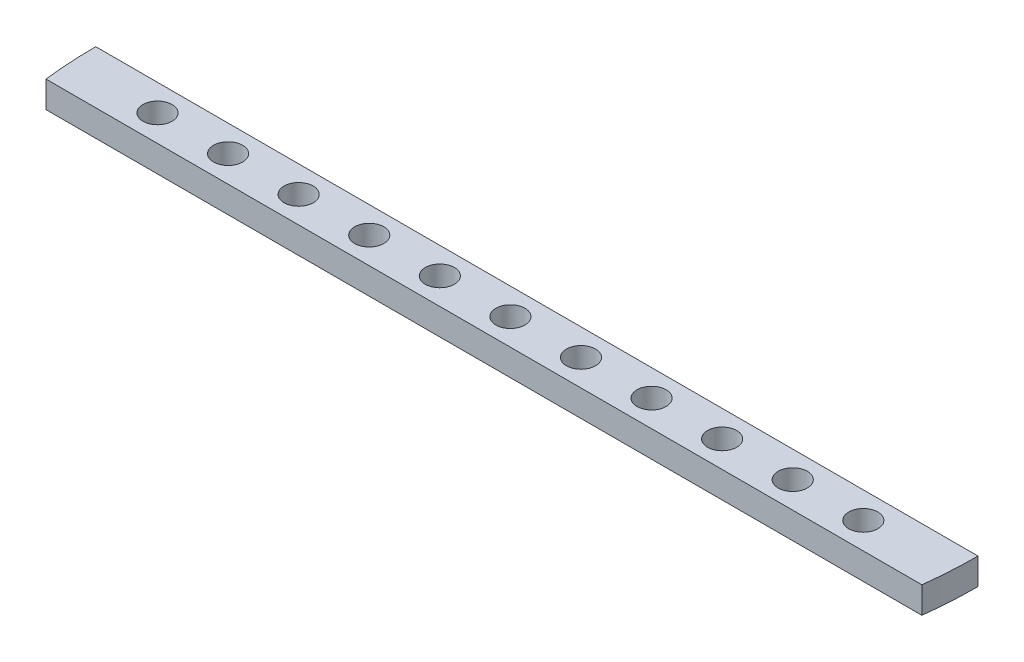
ISO-10303-21;
HEADER;
FILE_DESCRIPTION(('STEP AP214'),'2;1');
FILE_NAME('part.step','',(''),(''),'','','');
FILE_SCHEMA(('AUTOMOTIVE_DESIGN { 1 0 10303 214 1 1 1 1 }'));
ENDSEC;
DATA;
#1=APPLICATION_CONTEXT('core data for automotive mechanical design processes');
#2=APPLICATION_PROTOCOL_DEFINITION('international standard','automotive_design',2000,#1);
#3=PRODUCT_CONTEXT('',#1,'mechanical');
#4=PRODUCT('Part','Part','',(#3));
#5=PRODUCT_RELATED_PRODUCT_CATEGORY('part','',(#4));
#6=PRODUCT_DEFINITION_FORMATION('','',#4);
#7=PRODUCT_DEFINITION_CONTEXT('part definition',#1,'design');
#8=PRODUCT_DEFINITION('design','',#6,#7);
#9=PRODUCT_DEFINITION_SHAPE('','',#8);
#10=(LENGTH_UNIT() NAMED_UNIT(*) SI_UNIT(.MILLI.,.METRE.));
#11=(NAMED_UNIT(*) PLANE_ANGLE_UNIT() SI_UNIT($,.RADIAN.));
#12=(NAMED_UNIT(*) SI_UNIT($,.STERADIAN.) SOLID_ANGLE_UNIT());
#13=UNCERTAINTY_MEASURE_WITH_UNIT(LENGTH_MEASURE(1.E-05),#10,'distance_accuracy_value','');
#14=(GEOMETRIC_REPRESENTATION_CONTEXT(3) GLOBAL_UNCERTAINTY_ASSIGNED_CONTEXT((#13)) GLOBAL_UNIT_ASSIGNED_CONTEXT((#10,
#11,#12)) REPRESENTATION_CONTEXT('',''));
#15=CARTESIAN_POINT('',(0.,0.,0.));
#16=DIRECTION('',(0.,0.,1.));
#17=DIRECTION('',(1.,0.,0.));
#18=AXIS2_PLACEMENT_3D('',#15,#16,#17);
#19=CARTESIAN_POINT('',(0.,4.,0.));
#20=DIRECTION('',(0.,-1.,0.));
#21=DIRECTION('',(0.,0.,-1.));
#22=AXIS2_PLACEMENT_3D('',#19,#20,#21);
#23=CYLINDRICAL_SURFACE('',#22,50.);
#24=DIRECTION('',(0.,1.,0.));
#25=VECTOR('',#24,1.);
#26=CARTESIAN_POINT('',(-49.6386945839634,-7.,6.00000000000001));
#27=LINE('',#26,#25);
#28=CARTESIAN_POINT('',(-49.6386945839634,0.,6.00000000000001));
#29=VERTEX_POINT('',#28);
#30=CARTESIAN_POINT('',(-49.6386945839634,3.,6.00000000000001));
#31=VERTEX_POINT('',#30);
#32=EDGE_CURVE('E82',#29,#31,#27,.T.);
#33=ORIENTED_EDGE('',*,*,#32,.T.);
#34=CARTESIAN_POINT('',(0.,3.,0.));
#35=DIRECTION('',(0.,-1.,0.));
#36=DIRECTION('',(0.,0.,-1.));
#37=AXIS2_PLACEMENT_3D('',#34,#35,#36);
#38=CIRCLE('',#37,50.);
#39=CARTESIAN_POINT('',(-50.,3.,0.));
#40=VERTEX_POINT('',#39);
#41=EDGE_CURVE('E89',#31,#40,#38,.T.);
#42=ORIENTED_EDGE('',*,*,#41,.T.);
#43=DIRECTION('',(0.,-1.,0.));
#44=VECTOR('',#43,1.);
#45=CARTESIAN_POINT('',(-50.,4.,0.));
#46=LINE('',#45,#44);
#47=CARTESIAN_POINT('',(-50.,0.,0.));
#48=VERTEX_POINT('',#47);
#49=EDGE_CURVE('E48',#40,#48,#46,.T.);
#50=ORIENTED_EDGE('',*,*,#49,.T.);
#51=CARTESIAN_POINT('',(0.,0.,0.));
#52=DIRECTION('',(0.,1.,0.));
#53=DIRECTION('',(0.,0.,-1.));
#54=AXIS2_PLACEMENT_3D('',#51,#52,#53);
#55=CIRCLE('',#54,50.);
#56=EDGE_CURVE('E92',#48,#29,#55,.T.);
#57=ORIENTED_EDGE('',*,*,#56,.T.);
#58=EDGE_LOOP('',(#33,#42,#50,#57));
#59=FACE_BOUND('',#58,.T.);
#60=ADVANCED_FACE('F39',(#59),#23,.T.);
#61=DIRECTION('',(0.,1.,0.));
#62=VECTOR('',#61,1.);
#63=CARTESIAN_POINT('',(49.6386945839634,-7.,6.00000000000001));
#64=LINE('',#63,#62);
#65=CARTESIAN_POINT('',(49.6386945839634,0.,6.00000000000001));
#66=VERTEX_POINT('',#65);
#67=CARTESIAN_POINT('',(49.6386945839634,3.,6.00000000000001));
#68=VERTEX_POINT('',#67);
#69=EDGE_CURVE('E56',#66,#68,#64,.T.);
#70=ORIENTED_EDGE('',*,*,#69,.F.);
#71=CARTESIAN_POINT('',(50.,0.,0.));
#72=VERTEX_POINT('',#71);
#73=EDGE_CURVE('E153',#66,#72,#55,.T.);
#74=ORIENTED_EDGE('',*,*,#73,.T.);
#75=DIRECTION('',(0.,-1.,0.));
#76=VECTOR('',#75,1.);
#77=CARTESIAN_POINT('',(50.,4.,0.));
#78=LINE('',#77,#76);
#79=CARTESIAN_POINT('',(50.,3.,0.));
#80=VERTEX_POINT('',#79);
#81=EDGE_CURVE('E12',#80,#72,#78,.T.);
#82=ORIENTED_EDGE('',*,*,#81,.F.);
#83=CARTESIAN_POINT('',(0.,3.,0.));
#84=DIRECTION('',(0.,-1.,0.));
#85=DIRECTION('',(0.,0.,-1.));
#86=AXIS2_PLACEMENT_3D('',#83,#84,#85);
#87=CIRCLE('',#86,50.);
#88=EDGE_CURVE('E100',#80,#68,#87,.T.);
#89=ORIENTED_EDGE('',*,*,#88,.T.);
#90=EDGE_LOOP('',(#70,#74,#82,#89));
#91=FACE_BOUND('',#90,.T.);
#92=ADVANCED_FACE('F205',(#91),#23,.T.);
#93=CARTESIAN_POINT('',(0.,0.,0.));
#94=DIRECTION('',(0.,-1.,0.));
#95=DIRECTION('',(0.,0.,-1.));
#96=AXIS2_PLACEMENT_3D('',#93,#94,#95);
#97=PLANE('',#96);
#98=CARTESIAN_POINT('',(0.,0.,3.00000000000001));
#99=DIRECTION('',(0.,-1.,0.));
#100=DIRECTION('',(0.,0.,-1.));
#101=AXIS2_PLACEMENT_3D('',#98,#99,#100);
#102=CIRCLE('',#101,1.65);
#103=CARTESIAN_POINT('',(0.,0.,1.35000000000001));
#104=VERTEX_POINT('',#103);
#105=EDGE_CURVE('E149',#104,#104,#102,.T.);
#106=ORIENTED_EDGE('',*,*,#105,.F.);
#107=EDGE_LOOP('',(#106));
#108=FACE_BOUND('',#107,.T.);
#109=CARTESIAN_POINT('',(-8.,0.,3.00000000000001));
#110=DIRECTION('',(0.,-1.,0.));
#111=DIRECTION('',(0.,0.,-1.));
#112=AXIS2_PLACEMENT_3D('',#109,#110,#111);
#113=CIRCLE('',#112,1.65);
#114=CARTESIAN_POINT('',(-8.,0.,1.35000000000001));
#115=VERTEX_POINT('',#114);
#116=EDGE_CURVE('E161',#115,#115,#113,.T.);
#117=ORIENTED_EDGE('',*,*,#116,.F.);
#118=EDGE_LOOP('',(#117));
#119=FACE_BOUND('',#118,.T.);
#120=CARTESIAN_POINT('',(-16.,0.,3.00000000000001));
#121=DIRECTION('',(0.,-1.,0.));
#122=DIRECTION('',(0.,0.,-1.));
#123=AXIS2_PLACEMENT_3D('',#120,#121,#122);
#124=CIRCLE('',#123,1.65);
#125=CARTESIAN_POINT('',(-16.,0.,1.35000000000001));
#126=VERTEX_POINT('',#125);
#127=EDGE_CURVE('E165',#126,#126,#124,.T.);
#128=ORIENTED_EDGE('',*,*,#127,.F.);
#129=EDGE_LOOP('',(#128));
#130=FACE_BOUND('',#129,.T.);
#131=CARTESIAN_POINT('',(-40.,0.,3.00000000000002));
#132=DIRECTION('',(0.,-1.,0.));
#133=DIRECTION('',(0.,0.,-1.));
#134=AXIS2_PLACEMENT_3D('',#131,#132,#133);
#135=CIRCLE('',#134,1.65);
#136=CARTESIAN_POINT('',(-40.,0.,1.35000000000001));
#137=VERTEX_POINT('',#136);
#138=EDGE_CURVE('E169',#137,#137,#135,.T.);
#139=ORIENTED_EDGE('',*,*,#138,.F.);
#140=EDGE_LOOP('',(#139));
#141=FACE_BOUND('',#140,.T.);
#142=CARTESIAN_POINT('',(8.,0.,3.00000000000001));
#143=DIRECTION('',(0.,-1.,0.));
#144=DIRECTION('',(0.,0.,-1.));
#145=AXIS2_PLACEMENT_3D('',#142,#143,#144);
#146=CIRCLE('',#145,1.65);
#147=CARTESIAN_POINT('',(8.,0.,1.35000000000001));
#148=VERTEX_POINT('',#147);
#149=EDGE_CURVE('E173',#148,#148,#146,.T.);
#150=ORIENTED_EDGE('',*,*,#149,.F.);
#151=EDGE_LOOP('',(#150));
#152=FACE_BOUND('',#151,.T.);
#153=CARTESIAN_POINT('',(16.,0.,3.00000000000001));
#154=DIRECTION('',(0.,-1.,0.));
#155=DIRECTION('',(0.,0.,-1.));
#156=AXIS2_PLACEMENT_3D('',#153,#154,#155);
#157=CIRCLE('',#156,1.65);
#158=CARTESIAN_POINT('',(16.,0.,1.35000000000001));
#159=VERTEX_POINT('',#158);
#160=EDGE_CURVE('E177',#159,#159,#157,.T.);
#161=ORIENTED_EDGE('',*,*,#160,.F.);
#162=EDGE_LOOP('',(#161));
#163=FACE_BOUND('',#162,.T.);
#164=CARTESIAN_POINT('',(24.,0.,3.00000000000001));
#165=DIRECTION('',(0.,-1.,0.));
#166=DIRECTION('',(0.,0.,-1.));
#167=AXIS2_PLACEMENT_3D('',#164,#165,#166);
#168=CIRCLE('',#167,1.65);
#169=CARTESIAN_POINT('',(24.,0.,1.35000000000001));
#170=VERTEX_POINT('',#169);
#171=EDGE_CURVE('E181',#170,#170,#168,.T.);
#172=ORIENTED_EDGE('',*,*,#171,.F.);
#173=EDGE_LOOP('',(#172));
#174=FACE_BOUND('',#173,.T.);
#175=CARTESIAN_POINT('',(32.,0.,3.00000000000001));
#176=DIRECTION('',(0.,-1.,0.));
#177=DIRECTION('',(0.,0.,-1.));
#178=AXIS2_PLACEMENT_3D('',#175,#176,#177);
#179=CIRCLE('',#178,1.65);
#180=CARTESIAN_POINT('',(32.,0.,1.35000000000001));
#181=VERTEX_POINT('',#180);
#182=EDGE_CURVE('E185',#181,#181,#179,.T.);
#183=ORIENTED_EDGE('',*,*,#182,.F.);
#184=EDGE_LOOP('',(#183));
#185=FACE_BOUND('',#184,.T.);
#186=CARTESIAN_POINT('',(40.,0.,3.00000000000001));
#187=DIRECTION('',(0.,-1.,0.));
#188=DIRECTION('',(0.,0.,-1.));
#189=AXIS2_PLACEMENT_3D('',#186,#187,#188);
#190=CIRCLE('',#189,1.65);
#191=CARTESIAN_POINT('',(40.,0.,1.35000000000001));
#192=VERTEX_POINT('',#191);
#193=EDGE_CURVE('E189',#192,#192,#190,.T.);
#194=ORIENTED_EDGE('',*,*,#193,.F.);
#195=EDGE_LOOP('',(#194));
#196=FACE_BOUND('',#195,.T.);
#197=CARTESIAN_POINT('',(-32.,0.,3.00000000000002));
#198=DIRECTION('',(0.,-1.,0.));
#199=DIRECTION('',(0.,0.,-1.));
#200=AXIS2_PLACEMENT_3D('',#197,#198,#199);
#201=CIRCLE('',#200,1.65);
#202=CARTESIAN_POINT('',(-32.,0.,1.35000000000001));
#203=VERTEX_POINT('',#202);
#204=EDGE_CURVE('E192',#203,#203,#201,.T.);
#205=ORIENTED_EDGE('',*,*,#204,.F.);
#206=EDGE_LOOP('',(#205));
#207=FACE_BOUND('',#206,.T.);
#208=CARTESIAN_POINT('',(-24.,0.,3.00000000000001));
#209=DIRECTION('',(0.,-1.,0.));
#210=DIRECTION('',(0.,0.,-1.));
#211=AXIS2_PLACEMENT_3D('',#208,#209,#210);
#212=CIRCLE('',#211,1.65);
#213=CARTESIAN_POINT('',(-24.,0.,1.35000000000001));
#214=VERTEX_POINT('',#213);
#215=EDGE_CURVE('E42',#214,#214,#212,.T.);
#216=ORIENTED_EDGE('',*,*,#215,.F.);
#217=EDGE_LOOP('',(#216));
#218=FACE_BOUND('',#217,.T.);
#219=ORIENTED_EDGE('',*,*,#73,.F.);
#220=DIRECTION('',(-1.,0.,0.));
#221=VECTOR('',#220,1.);
#222=CARTESIAN_POINT('',(0.,0.,6.00000000000001));
#223=LINE('',#222,#221);
#224=EDGE_CURVE('E211',#66,#29,#223,.T.);
#225=ORIENTED_EDGE('',*,*,#224,.T.);
#226=ORIENTED_EDGE('',*,*,#56,.F.);
#227=DIRECTION('',(-1.,0.,0.));
#228=VECTOR('',#227,1.);
#229=CARTESIAN_POINT('',(-50.,0.,0.));
#230=LINE('',#229,#228);
#231=EDGE_CURVE('E152',#72,#48,#230,.T.);
#232=ORIENTED_EDGE('',*,*,#231,.F.);
#233=EDGE_LOOP('',(#219,#225,#226,#232));
#234=FACE_BOUND('',#233,.T.);
#235=ADVANCED_FACE('F210',(#108,#119,#130,#141,#152,#163,#174,#185,#196,#207,#218,#234),#97,.T.);
#236=CARTESIAN_POINT('',(50.,3.,10.));
#237=DIRECTION('',(0.,-1.,0.));
#238=DIRECTION('',(0.,0.,-1.));
#239=AXIS2_PLACEMENT_3D('',#236,#237,#238);
#240=PLANE('',#239);
#241=CARTESIAN_POINT('',(0.,3.,3.00000000000001));
#242=DIRECTION('',(0.,-1.,0.));
#243=DIRECTION('',(0.,0.,-1.));
#244=AXIS2_PLACEMENT_3D('',#241,#242,#243);
#245=CIRCLE('',#244,1.65);
#246=CARTESIAN_POINT('',(0.,3.,1.35000000000001));
#247=VERTEX_POINT('',#246);
#248=EDGE_CURVE('E145',#247,#247,#245,.F.);
#249=ORIENTED_EDGE('',*,*,#248,.F.);
#250=EDGE_LOOP('',(#249));
#251=FACE_BOUND('',#250,.T.);
#252=CARTESIAN_POINT('',(-16.,3.,3.00000000000001));
#253=DIRECTION('',(0.,-1.,0.));
#254=DIRECTION('',(0.,0.,-1.));
#255=AXIS2_PLACEMENT_3D('',#252,#253,#254);
#256=CIRCLE('',#255,1.65);
#257=CARTESIAN_POINT('',(-16.,3.,1.35000000000001));
#258=VERTEX_POINT('',#257);
#259=EDGE_CURVE('E137',#258,#258,#256,.F.);
#260=ORIENTED_EDGE('',*,*,#259,.F.);
#261=EDGE_LOOP('',(#260));
#262=FACE_BOUND('',#261,.T.);
#263=CARTESIAN_POINT('',(8.,3.,3.00000000000001));
#264=DIRECTION('',(0.,-1.,0.));
#265=DIRECTION('',(0.,0.,-1.));
#266=AXIS2_PLACEMENT_3D('',#263,#264,#265);
#267=CIRCLE('',#266,1.65);
#268=CARTESIAN_POINT('',(8.,3.,1.35000000000001));
#269=VERTEX_POINT('',#268);
#270=EDGE_CURVE('E129',#269,#269,#267,.F.);
#271=ORIENTED_EDGE('',*,*,#270,.F.);
#272=EDGE_LOOP('',(#271));
#273=FACE_BOUND('',#272,.T.);
#274=CARTESIAN_POINT('',(24.,3.,3.00000000000001));
#275=DIRECTION('',(0.,-1.,0.));
#276=DIRECTION('',(0.,0.,-1.));
#277=AXIS2_PLACEMENT_3D('',#274,#275,#276);
#278=CIRCLE('',#277,1.65);
#279=CARTESIAN_POINT('',(24.,3.,1.35000000000001));
#280=VERTEX_POINT('',#279);
#281=EDGE_CURVE('E121',#280,#280,#278,.F.);
#282=ORIENTED_EDGE('',*,*,#281,.F.);
#283=EDGE_LOOP('',(#282));
#284=FACE_BOUND('',#283,.T.);
#285=CARTESIAN_POINT('',(40.,3.,3.00000000000001));
#286=DIRECTION('',(0.,-1.,0.));
#287=DIRECTION('',(0.,0.,-1.));
#288=AXIS2_PLACEMENT_3D('',#285,#286,#287);
#289=CIRCLE('',#288,1.65);
#290=CARTESIAN_POINT('',(40.,3.,1.35000000000001));
#291=VERTEX_POINT('',#290);
#292=EDGE_CURVE('E113',#291,#291,#289,.F.);
#293=ORIENTED_EDGE('',*,*,#292,.F.);
#294=EDGE_LOOP('',(#293));
#295=FACE_BOUND('',#294,.T.);
#296=CARTESIAN_POINT('',(-24.,3.,3.00000000000001));
#297=DIRECTION('',(0.,-1.,0.));
#298=DIRECTION('',(0.,0.,-1.));
#299=AXIS2_PLACEMENT_3D('',#296,#297,#298);
#300=CIRCLE('',#299,1.65);
#301=CARTESIAN_POINT('',(-24.,3.,1.35000000000001));
#302=VERTEX_POINT('',#301);
#303=EDGE_CURVE('E99',#302,#302,#300,.F.);
#304=ORIENTED_EDGE('',*,*,#303,.F.);
#305=EDGE_LOOP('',(#304));
#306=FACE_BOUND('',#305,.T.);
#307=CARTESIAN_POINT('',(-32.,3.,3.00000000000002));
#308=DIRECTION('',(0.,-1.,0.));
#309=DIRECTION('',(0.,0.,-1.));
#310=AXIS2_PLACEMENT_3D('',#307,#308,#309);
#311=CIRCLE('',#310,1.65);
#312=CARTESIAN_POINT('',(-32.,3.,1.35000000000001));
#313=VERTEX_POINT('',#312);
#314=EDGE_CURVE('E105',#313,#313,#311,.F.);
#315=ORIENTED_EDGE('',*,*,#314,.F.);
#316=EDGE_LOOP('',(#315));
#317=FACE_BOUND('',#316,.T.);
#318=CARTESIAN_POINT('',(32.,3.,3.00000000000001));
#319=DIRECTION('',(0.,-1.,0.));
#320=DIRECTION('',(0.,0.,-1.));
#321=AXIS2_PLACEMENT_3D('',#318,#319,#320);
#322=CIRCLE('',#321,1.65);
#323=CARTESIAN_POINT('',(32.,3.,1.35000000000001));
#324=VERTEX_POINT('',#323);
#325=EDGE_CURVE('E117',#324,#324,#322,.F.);
#326=ORIENTED_EDGE('',*,*,#325,.F.);
#327=EDGE_LOOP('',(#326));
#328=FACE_BOUND('',#327,.T.);
#329=CARTESIAN_POINT('',(16.,3.,3.00000000000001));
#330=DIRECTION('',(0.,-1.,0.));
#331=DIRECTION('',(0.,0.,-1.));
#332=AXIS2_PLACEMENT_3D('',#329,#330,#331);
#333=CIRCLE('',#332,1.65);
#334=CARTESIAN_POINT('',(16.,3.,1.35000000000001));
#335=VERTEX_POINT('',#334);
#336=EDGE_CURVE('E125',#335,#335,#333,.F.);
#337=ORIENTED_EDGE('',*,*,#336,.F.);
#338=EDGE_LOOP('',(#337));
#339=FACE_BOUND('',#338,.T.);
#340=CARTESIAN_POINT('',(-40.,3.,3.00000000000002));
#341=DIRECTION('',(0.,-1.,0.));
#342=DIRECTION('',(0.,0.,-1.));
#343=AXIS2_PLACEMENT_3D('',#340,#341,#342);
#344=CIRCLE('',#343,1.65);
#345=CARTESIAN_POINT('',(-40.,3.,1.35000000000001));
#346=VERTEX_POINT('',#345);
#347=EDGE_CURVE('E133',#346,#346,#344,.F.);
#348=ORIENTED_EDGE('',*,*,#347,.F.);
#349=EDGE_LOOP('',(#348));
#350=FACE_BOUND('',#349,.T.);
#351=CARTESIAN_POINT('',(-8.,3.,3.00000000000001));
#352=DIRECTION('',(0.,-1.,0.));
#353=DIRECTION('',(0.,0.,-1.));
#354=AXIS2_PLACEMENT_3D('',#351,#352,#353);
#355=CIRCLE('',#354,1.65);
#356=CARTESIAN_POINT('',(-8.,3.,1.35000000000001));
#357=VERTEX_POINT('',#356);
#358=EDGE_CURVE('E141',#357,#357,#355,.F.);
#359=ORIENTED_EDGE('',*,*,#358,.F.);
#360=EDGE_LOOP('',(#359));
#361=FACE_BOUND('',#360,.T.);
#362=DIRECTION('',(1.,0.,0.));
#363=VECTOR('',#362,1.);
#364=CARTESIAN_POINT('',(0.,3.,6.00000000000001));
#365=LINE('',#364,#363);
#366=EDGE_CURVE('E79',#31,#68,#365,.T.);
#367=ORIENTED_EDGE('',*,*,#366,.T.);
#368=ORIENTED_EDGE('',*,*,#88,.F.);
#369=DIRECTION('',(-1.,0.,0.));
#370=VECTOR('',#369,1.);
#371=CARTESIAN_POINT('',(50.,3.,0.));
#372=LINE('',#371,#370);
#373=EDGE_CURVE('E97',#80,#40,#372,.T.);
#374=ORIENTED_EDGE('',*,*,#373,.T.);
#375=ORIENTED_EDGE('',*,*,#41,.F.);
#376=EDGE_LOOP('',(#367,#368,#374,#375));
#377=FACE_BOUND('',#376,.T.);
#378=ADVANCED_FACE('F95',(#251,#262,#273,#284,#295,#306,#317,#328,#339,#350,#361,#377),#240,.F.);
#379=CARTESIAN_POINT('',(-50.,4.,0.));
#380=DIRECTION('',(0.,0.,1.));
#381=DIRECTION('',(1.,0.,0.));
#382=AXIS2_PLACEMENT_3D('',#379,#380,#381);
#383=PLANE('',#382);
#384=ORIENTED_EDGE('',*,*,#49,.F.);
#385=ORIENTED_EDGE('',*,*,#373,.F.);
#386=ORIENTED_EDGE('',*,*,#81,.T.);
#387=ORIENTED_EDGE('',*,*,#231,.T.);
#388=EDGE_LOOP('',(#384,#385,#386,#387));
#389=FACE_BOUND('',#388,.T.);
#390=ADVANCED_FACE('F209',(#389),#383,.F.);
#391=CARTESIAN_POINT('',(0.,-6.,3.00000000000001));
#392=DIRECTION('',(0.,1.,0.));
#393=DIRECTION('',(0.,0.,1.));
#394=AXIS2_PLACEMENT_3D('',#391,#392,#393);
#395=CYLINDRICAL_SURFACE('',#394,1.65);
#396=ORIENTED_EDGE('',*,*,#248,.T.);
#397=EDGE_LOOP('',(#396));
#398=FACE_BOUND('',#397,.T.);
#399=ORIENTED_EDGE('',*,*,#105,.T.);
#400=EDGE_LOOP('',(#399));
#401=FACE_BOUND('',#400,.T.);
#402=ADVANCED_FACE('F337',(#398,#401),#395,.F.);
#403=CARTESIAN_POINT('',(-8.,-6.,3.00000000000001));
#404=DIRECTION('',(0.,1.,0.));
#405=DIRECTION('',(0.,0.,1.));
#406=AXIS2_PLACEMENT_3D('',#403,#404,#405);
#407=CYLINDRICAL_SURFACE('',#406,1.65);
#408=ORIENTED_EDGE('',*,*,#358,.T.);
#409=EDGE_LOOP('',(#408));
#410=FACE_BOUND('',#409,.T.);
#411=ORIENTED_EDGE('',*,*,#116,.T.);
#412=EDGE_LOOP('',(#411));
#413=FACE_BOUND('',#412,.T.);
#414=ADVANCED_FACE('F329',(#410,#413),#407,.F.);
#415=CARTESIAN_POINT('',(-16.,-6.,3.00000000000001));
#416=DIRECTION('',(0.,1.,0.));
#417=DIRECTION('',(0.,0.,1.));
#418=AXIS2_PLACEMENT_3D('',#415,#416,#417);
#419=CYLINDRICAL_SURFACE('',#418,1.65);
#420=ORIENTED_EDGE('',*,*,#259,.T.);
#421=EDGE_LOOP('',(#420));
#422=FACE_BOUND('',#421,.T.);
#423=ORIENTED_EDGE('',*,*,#127,.T.);
#424=EDGE_LOOP('',(#423));
#425=FACE_BOUND('',#424,.T.);
#426=ADVANCED_FACE('F321',(#422,#425),#419,.F.);
#427=CARTESIAN_POINT('',(-40.,-6.,3.00000000000002));
#428=DIRECTION('',(0.,1.,0.));
#429=DIRECTION('',(0.,0.,1.));
#430=AXIS2_PLACEMENT_3D('',#427,#428,#429);
#431=CYLINDRICAL_SURFACE('',#430,1.65);
#432=ORIENTED_EDGE('',*,*,#347,.T.);
#433=EDGE_LOOP('',(#432));
#434=FACE_BOUND('',#433,.T.);
#435=ORIENTED_EDGE('',*,*,#138,.T.);
#436=EDGE_LOOP('',(#435));
#437=FACE_BOUND('',#436,.T.);
#438=ADVANCED_FACE('F313',(#434,#437),#431,.F.);
#439=CARTESIAN_POINT('',(8.,-6.,3.00000000000001));
#440=DIRECTION('',(0.,1.,0.));
#441=DIRECTION('',(0.,0.,1.));
#442=AXIS2_PLACEMENT_3D('',#439,#440,#441);
#443=CYLINDRICAL_SURFACE('',#442,1.65);
#444=ORIENTED_EDGE('',*,*,#270,.T.);
#445=EDGE_LOOP('',(#444));
#446=FACE_BOUND('',#445,.T.);
#447=ORIENTED_EDGE('',*,*,#149,.T.);
#448=EDGE_LOOP('',(#447));
#449=FACE_BOUND('',#448,.T.);
#450=ADVANCED_FACE('F305',(#446,#449),#443,.F.);
#451=CARTESIAN_POINT('',(16.,-6.,3.00000000000001));
#452=DIRECTION('',(0.,1.,0.));
#453=DIRECTION('',(0.,0.,1.));
#454=AXIS2_PLACEMENT_3D('',#451,#452,#453);
#455=CYLINDRICAL_SURFACE('',#454,1.65);
#456=ORIENTED_EDGE('',*,*,#336,.T.);
#457=EDGE_LOOP('',(#456));
#458=FACE_BOUND('',#457,.T.);
#459=ORIENTED_EDGE('',*,*,#160,.T.);
#460=EDGE_LOOP('',(#459));
#461=FACE_BOUND('',#460,.T.);
#462=ADVANCED_FACE('F297',(#458,#461),#455,.F.);
#463=CARTESIAN_POINT('',(24.,-6.,3.00000000000001));
#464=DIRECTION('',(0.,1.,0.));
#465=DIRECTION('',(0.,0.,1.));
#466=AXIS2_PLACEMENT_3D('',#463,#464,#465);
#467=CYLINDRICAL_SURFACE('',#466,1.65);
#468=ORIENTED_EDGE('',*,*,#281,.T.);
#469=EDGE_LOOP('',(#468));
#470=FACE_BOUND('',#469,.T.);
#471=ORIENTED_EDGE('',*,*,#171,.T.);
#472=EDGE_LOOP('',(#471));
#473=FACE_BOUND('',#472,.T.);
#474=ADVANCED_FACE('F289',(#470,#473),#467,.F.);
#475=CARTESIAN_POINT('',(32.,-6.,3.00000000000001));
#476=DIRECTION('',(0.,1.,0.));
#477=DIRECTION('',(0.,0.,1.));
#478=AXIS2_PLACEMENT_3D('',#475,#476,#477);
#479=CYLINDRICAL_SURFACE('',#478,1.65);
#480=ORIENTED_EDGE('',*,*,#325,.T.);
#481=EDGE_LOOP('',(#480));
#482=FACE_BOUND('',#481,.T.);
#483=ORIENTED_EDGE('',*,*,#182,.T.);
#484=EDGE_LOOP('',(#483));
#485=FACE_BOUND('',#484,.T.);
#486=ADVANCED_FACE('F281',(#482,#485),#479,.F.);
#487=CARTESIAN_POINT('',(40.,-6.,3.00000000000001));
#488=DIRECTION('',(0.,1.,0.));
#489=DIRECTION('',(0.,0.,1.));
#490=AXIS2_PLACEMENT_3D('',#487,#488,#489);
#491=CYLINDRICAL_SURFACE('',#490,1.65);
#492=ORIENTED_EDGE('',*,*,#292,.T.);
#493=EDGE_LOOP('',(#492));
#494=FACE_BOUND('',#493,.T.);
#495=ORIENTED_EDGE('',*,*,#193,.T.);
#496=EDGE_LOOP('',(#495));
#497=FACE_BOUND('',#496,.T.);
#498=ADVANCED_FACE('F273',(#494,#497),#491,.F.);
#499=CARTESIAN_POINT('',(-32.,-6.,3.00000000000002));
#500=DIRECTION('',(0.,1.,0.));
#501=DIRECTION('',(0.,0.,1.));
#502=AXIS2_PLACEMENT_3D('',#499,#500,#501);
#503=CYLINDRICAL_SURFACE('',#502,1.65);
#504=ORIENTED_EDGE('',*,*,#314,.T.);
#505=EDGE_LOOP('',(#504));
#506=FACE_BOUND('',#505,.T.);
#507=ORIENTED_EDGE('',*,*,#204,.T.);
#508=EDGE_LOOP('',(#507));
#509=FACE_BOUND('',#508,.T.);
#510=ADVANCED_FACE('F266',(#506,#509),#503,.F.);
#511=CARTESIAN_POINT('',(-24.,-6.,3.00000000000001));
#512=DIRECTION('',(0.,1.,0.));
#513=DIRECTION('',(0.,0.,1.));
#514=AXIS2_PLACEMENT_3D('',#511,#512,#513);
#515=CYLINDRICAL_SURFACE('',#514,1.65);
#516=ORIENTED_EDGE('',*,*,#303,.T.);
#517=EDGE_LOOP('',(#516));
#518=FACE_BOUND('',#517,.T.);
#519=ORIENTED_EDGE('',*,*,#215,.T.);
#520=EDGE_LOOP('',(#519));
#521=FACE_BOUND('',#520,.T.);
#522=ADVANCED_FACE('F257',(#518,#521),#515,.F.);
#523=CARTESIAN_POINT('',(0.,-7.,6.00000000000001));
#524=DIRECTION('',(0.,0.,1.));
#525=DIRECTION('',(1.,0.,0.));
#526=AXIS2_PLACEMENT_3D('',#523,#524,#525);
#527=PLANE('',#526);
#528=ORIENTED_EDGE('',*,*,#69,.T.);
#529=ORIENTED_EDGE('',*,*,#366,.F.);
#530=ORIENTED_EDGE('',*,*,#32,.F.);
#531=ORIENTED_EDGE('',*,*,#224,.F.);
#532=EDGE_LOOP('',(#528,#529,#530,#531));
#533=FACE_BOUND('',#532,.T.);
#534=ADVANCED_FACE('F81',(#533),#527,.T.);
#535=CLOSED_SHELL('',(#60,#92,#235,#378,#390,#402,#414,#426,#438,#450,#462,#474,#486,#498,#510,
#522,#534));
#536=MANIFOLD_SOLID_BREP('B2',#535);
#537=ADVANCED_BREP_SHAPE_REPRESENTATION('',(#18,#536),#14);
#538=SHAPE_DEFINITION_REPRESENTATION(#9,#537);
ENDSEC;
END-ISO-10303-21;
